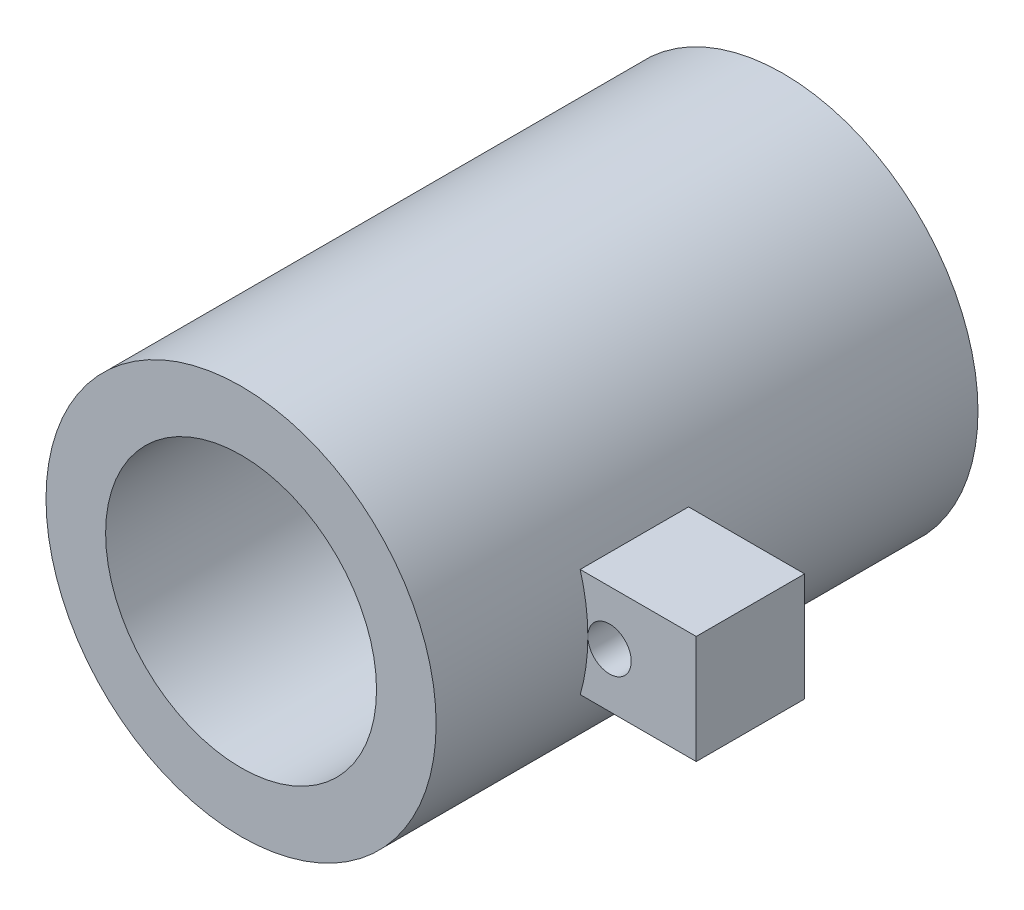
ISO-10303-21;
HEADER;
FILE_DESCRIPTION(('STEP AP214'),'2;1');
FILE_NAME('part.step','',(''),(''),'','','');
FILE_SCHEMA(('AUTOMOTIVE_DESIGN { 1 0 10303 214 1 1 1 1 }'));
ENDSEC;
DATA;
#1=APPLICATION_CONTEXT('core data for automotive mechanical design processes');
#2=APPLICATION_PROTOCOL_DEFINITION('international standard','automotive_design',2000,#1);
#3=PRODUCT_CONTEXT('',#1,'mechanical');
#4=PRODUCT('Part','Part','',(#3));
#5=PRODUCT_RELATED_PRODUCT_CATEGORY('part','',(#4));
#6=PRODUCT_DEFINITION_FORMATION('','',#4);
#7=PRODUCT_DEFINITION_CONTEXT('part definition',#1,'design');
#8=PRODUCT_DEFINITION('design','',#6,#7);
#9=PRODUCT_DEFINITION_SHAPE('','',#8);
#10=(LENGTH_UNIT() NAMED_UNIT(*) SI_UNIT(.MILLI.,.METRE.));
#11=(NAMED_UNIT(*) PLANE_ANGLE_UNIT() SI_UNIT($,.RADIAN.));
#12=(NAMED_UNIT(*) SI_UNIT($,.STERADIAN.) SOLID_ANGLE_UNIT());
#13=UNCERTAINTY_MEASURE_WITH_UNIT(LENGTH_MEASURE(1.E-05),#10,'distance_accuracy_value','');
#14=(GEOMETRIC_REPRESENTATION_CONTEXT(3) GLOBAL_UNCERTAINTY_ASSIGNED_CONTEXT((#13)) GLOBAL_UNIT_ASSIGNED_CONTEXT((#10,
#11,#12)) REPRESENTATION_CONTEXT('',''));
#15=CARTESIAN_POINT('',(0.,0.,0.));
#16=DIRECTION('',(0.,0.,1.));
#17=DIRECTION('',(1.,0.,0.));
#18=AXIS2_PLACEMENT_3D('',#15,#16,#17);
#19=CARTESIAN_POINT('',(0.,0.,12.5));
#20=DIRECTION('',(0.,0.,-1.));
#21=DIRECTION('',(-1.,0.,0.));
#22=AXIS2_PLACEMENT_3D('',#19,#20,#21);
#23=CYLINDRICAL_SURFACE('',#22,9.);
#24=CARTESIAN_POINT('',(0.,0.,0.499999999999999));
#25=DIRECTION('',(0.,0.,1.));
#26=DIRECTION('',(0.,-1.,0.));
#27=AXIS2_PLACEMENT_3D('',#24,#25,#26);
#28=CIRCLE('',#27,9.);
#29=CARTESIAN_POINT('',(9.,0.,0.499999999999999));
#30=VERTEX_POINT('',#29);
#31=CARTESIAN_POINT('',(8.64580823289529,2.5,0.5));
#32=VERTEX_POINT('',#31);
#33=EDGE_CURVE('E40',#30,#32,#28,.T.);
#34=ORIENTED_EDGE('',*,*,#33,.F.);
#35=CARTESIAN_POINT('',(8.64580823289529,-2.5,0.499999999999997));
#36=VERTEX_POINT('',#35);
#37=EDGE_CURVE('E11',#36,#30,#28,.T.);
#38=ORIENTED_EDGE('',*,*,#37,.F.);
#39=DIRECTION('',(0.,0.,-1.));
#40=VECTOR('',#39,1.);
#41=CARTESIAN_POINT('',(8.64580823289529,-2.5,12.5));
#42=LINE('',#41,#40);
#43=CARTESIAN_POINT('',(8.64580823289529,-2.5,5.5));
#44=VERTEX_POINT('',#43);
#45=EDGE_CURVE('E116',#44,#36,#42,.T.);
#46=ORIENTED_EDGE('',*,*,#45,.F.);
#47=CARTESIAN_POINT('',(0.,0.,5.5));
#48=DIRECTION('',(0.,0.,-1.));
#49=DIRECTION('',(0.,1.,0.));
#50=AXIS2_PLACEMENT_3D('',#47,#48,#49);
#51=CIRCLE('',#50,9.);
#52=CARTESIAN_POINT('',(9.,0.,5.5));
#53=VERTEX_POINT('',#52);
#54=EDGE_CURVE('E121',#53,#44,#51,.T.);
#55=ORIENTED_EDGE('',*,*,#54,.F.);
#56=CARTESIAN_POINT('',(8.64580823289529,2.5,5.5));
#57=VERTEX_POINT('',#56);
#58=EDGE_CURVE('E122',#57,#53,#51,.T.);
#59=ORIENTED_EDGE('',*,*,#58,.F.);
#60=DIRECTION('',(0.,0.,-1.));
#61=VECTOR('',#60,1.);
#62=CARTESIAN_POINT('',(8.64580823289529,2.5,12.5));
#63=LINE('',#62,#61);
#64=EDGE_CURVE('E124',#32,#57,#63,.F.);
#65=ORIENTED_EDGE('',*,*,#64,.F.);
#66=EDGE_LOOP('',(#34,#38,#46,#55,#59,#65));
#67=FACE_BOUND('',#66,.T.);
#68=CARTESIAN_POINT('',(0.,0.,-12.5));
#69=DIRECTION('',(0.,0.,1.));
#70=DIRECTION('',(1.,0.,0.));
#71=AXIS2_PLACEMENT_3D('',#68,#69,#70);
#72=CIRCLE('',#71,9.);
#73=CARTESIAN_POINT('',(9.,0.,-12.5));
#74=VERTEX_POINT('',#73);
#75=EDGE_CURVE('E111',#74,#74,#72,.T.);
#76=ORIENTED_EDGE('',*,*,#75,.T.);
#77=EDGE_LOOP('',(#76));
#78=FACE_BOUND('',#77,.T.);
#79=CARTESIAN_POINT('',(0.,0.,12.5));
#80=DIRECTION('',(0.,0.,1.));
#81=DIRECTION('',(1.,0.,0.));
#82=AXIS2_PLACEMENT_3D('',#79,#80,#81);
#83=CIRCLE('',#82,9.);
#84=CARTESIAN_POINT('',(9.,0.,12.5));
#85=VERTEX_POINT('',#84);
#86=EDGE_CURVE('E113',#85,#85,#83,.T.);
#87=ORIENTED_EDGE('',*,*,#86,.F.);
#88=EDGE_LOOP('',(#87));
#89=FACE_BOUND('',#88,.T.);
#90=ADVANCED_FACE('F33',(#67,#78,#89),#23,.T.);
#91=CARTESIAN_POINT('',(0.,0.,12.5));
#92=DIRECTION('',(0.,0.,1.));
#93=DIRECTION('',(1.,0.,0.));
#94=AXIS2_PLACEMENT_3D('',#91,#92,#93);
#95=PLANE('',#94);
#96=ORIENTED_EDGE('',*,*,#86,.T.);
#97=EDGE_LOOP('',(#96));
#98=FACE_BOUND('',#97,.T.);
#99=CARTESIAN_POINT('',(0.,0.,12.5));
#100=DIRECTION('',(0.,0.,1.));
#101=DIRECTION('',(1.,0.,0.));
#102=AXIS2_PLACEMENT_3D('',#99,#100,#101);
#103=CIRCLE('',#102,6.25);
#104=CARTESIAN_POINT('',(6.25,0.,12.5));
#105=VERTEX_POINT('',#104);
#106=EDGE_CURVE('E104',#105,#105,#103,.T.);
#107=ORIENTED_EDGE('',*,*,#106,.F.);
#108=EDGE_LOOP('',(#107));
#109=FACE_BOUND('',#108,.T.);
#110=ADVANCED_FACE('F142',(#98,#109),#95,.T.);
#111=CARTESIAN_POINT('',(0.,0.,-12.5));
#112=DIRECTION('',(0.,0.,1.));
#113=DIRECTION('',(1.,0.,0.));
#114=AXIS2_PLACEMENT_3D('',#111,#112,#113);
#115=PLANE('',#114);
#116=ORIENTED_EDGE('',*,*,#75,.F.);
#117=EDGE_LOOP('',(#116));
#118=FACE_BOUND('',#117,.T.);
#119=CARTESIAN_POINT('',(0.,0.,-12.5));
#120=DIRECTION('',(0.,0.,1.));
#121=DIRECTION('',(1.,0.,0.));
#122=AXIS2_PLACEMENT_3D('',#119,#120,#121);
#123=CIRCLE('',#122,6.25);
#124=CARTESIAN_POINT('',(6.25,0.,-12.5));
#125=VERTEX_POINT('',#124);
#126=EDGE_CURVE('E101',#125,#125,#123,.T.);
#127=ORIENTED_EDGE('',*,*,#126,.T.);
#128=EDGE_LOOP('',(#127));
#129=FACE_BOUND('',#128,.T.);
#130=ADVANCED_FACE('F149',(#118,#129),#115,.F.);
#131=CARTESIAN_POINT('',(0.,0.,12.5));
#132=DIRECTION('',(0.,0.,-1.));
#133=DIRECTION('',(-1.,0.,0.));
#134=AXIS2_PLACEMENT_3D('',#131,#132,#133);
#135=CYLINDRICAL_SURFACE('',#134,6.25);
#136=ORIENTED_EDGE('',*,*,#106,.T.);
#137=EDGE_LOOP('',(#136));
#138=FACE_BOUND('',#137,.T.);
#139=ORIENTED_EDGE('',*,*,#126,.F.);
#140=EDGE_LOOP('',(#139));
#141=FACE_BOUND('',#140,.T.);
#142=ADVANCED_FACE('F153',(#138,#141),#135,.F.);
#143=CARTESIAN_POINT('',(14.,2.5,5.5));
#144=DIRECTION('',(0.,-1.,0.));
#145=DIRECTION('',(0.,0.,-1.));
#146=AXIS2_PLACEMENT_3D('',#143,#144,#145);
#147=PLANE('',#146);
#148=DIRECTION('',(-1.,0.,0.));
#149=VECTOR('',#148,1.);
#150=CARTESIAN_POINT('',(14.,2.5,0.5));
#151=LINE('',#150,#149);
#152=CARTESIAN_POINT('',(14.,2.5,0.5));
#153=VERTEX_POINT('',#152);
#154=EDGE_CURVE('E82',#153,#32,#151,.T.);
#155=ORIENTED_EDGE('',*,*,#154,.T.);
#156=ORIENTED_EDGE('',*,*,#64,.T.);
#157=DIRECTION('',(-1.,0.,0.));
#158=VECTOR('',#157,1.);
#159=CARTESIAN_POINT('',(14.,2.5,5.5));
#160=LINE('',#159,#158);
#161=CARTESIAN_POINT('',(14.,2.5,5.5));
#162=VERTEX_POINT('',#161);
#163=EDGE_CURVE('E84',#162,#57,#160,.T.);
#164=ORIENTED_EDGE('',*,*,#163,.F.);
#165=DIRECTION('',(0.,0.,1.));
#166=VECTOR('',#165,1.);
#167=CARTESIAN_POINT('',(14.,2.5,5.5));
#168=LINE('',#167,#166);
#169=EDGE_CURVE('E77',#153,#162,#168,.T.);
#170=ORIENTED_EDGE('',*,*,#169,.F.);
#171=EDGE_LOOP('',(#155,#156,#164,#170));
#172=FACE_BOUND('',#171,.T.);
#173=ADVANCED_FACE('F79',(#172),#147,.F.);
#174=CARTESIAN_POINT('',(14.,-2.5,5.5));
#175=DIRECTION('',(0.,1.,0.));
#176=DIRECTION('',(0.,0.,1.));
#177=AXIS2_PLACEMENT_3D('',#174,#175,#176);
#178=PLANE('',#177);
#179=DIRECTION('',(-1.,0.,0.));
#180=VECTOR('',#179,1.);
#181=CARTESIAN_POINT('',(14.,-2.5,5.5));
#182=LINE('',#181,#180);
#183=CARTESIAN_POINT('',(14.,-2.5,5.5));
#184=VERTEX_POINT('',#183);
#185=EDGE_CURVE('E106',#184,#44,#182,.T.);
#186=ORIENTED_EDGE('',*,*,#185,.T.);
#187=ORIENTED_EDGE('',*,*,#45,.T.);
#188=DIRECTION('',(-1.,0.,0.));
#189=VECTOR('',#188,1.);
#190=CARTESIAN_POINT('',(14.,-2.5,0.499999999999997));
#191=LINE('',#190,#189);
#192=CARTESIAN_POINT('',(14.,-2.5,0.499999999999997));
#193=VERTEX_POINT('',#192);
#194=EDGE_CURVE('E131',#193,#36,#191,.T.);
#195=ORIENTED_EDGE('',*,*,#194,.F.);
#196=DIRECTION('',(0.,0.,-1.));
#197=VECTOR('',#196,1.);
#198=CARTESIAN_POINT('',(14.,-2.5,5.5));
#199=LINE('',#198,#197);
#200=EDGE_CURVE('E93',#184,#193,#199,.T.);
#201=ORIENTED_EDGE('',*,*,#200,.F.);
#202=EDGE_LOOP('',(#186,#187,#195,#201));
#203=FACE_BOUND('',#202,.T.);
#204=ADVANCED_FACE('F135',(#203),#178,.F.);
#205=CARTESIAN_POINT('',(14.,2.5,0.5));
#206=DIRECTION('',(0.,0.,1.));
#207=DIRECTION('',(0.,-1.,0.));
#208=AXIS2_PLACEMENT_3D('',#205,#206,#207);
#209=PLANE('',#208);
#210=ORIENTED_EDGE('',*,*,#37,.T.);
#211=CARTESIAN_POINT('',(10.,0.,0.499999999999999));
#212=DIRECTION('',(0.,0.,1.));
#213=DIRECTION('',(0.,-1.,0.));
#214=AXIS2_PLACEMENT_3D('',#211,#212,#213);
#215=CIRCLE('',#214,1.);
#216=EDGE_CURVE('E45',#30,#30,#215,.T.);
#217=ORIENTED_EDGE('',*,*,#216,.T.);
#218=ORIENTED_EDGE('',*,*,#33,.T.);
#219=ORIENTED_EDGE('',*,*,#154,.F.);
#220=DIRECTION('',(0.,1.,0.));
#221=VECTOR('',#220,1.);
#222=CARTESIAN_POINT('',(14.,2.5,0.5));
#223=LINE('',#222,#221);
#224=EDGE_CURVE('E88',#193,#153,#223,.T.);
#225=ORIENTED_EDGE('',*,*,#224,.F.);
#226=ORIENTED_EDGE('',*,*,#194,.T.);
#227=EDGE_LOOP('',(#210,#217,#218,#219,#225,#226));
#228=FACE_BOUND('',#227,.T.);
#229=ADVANCED_FACE('F98',(#228),#209,.F.);
#230=CARTESIAN_POINT('',(14.,2.5,5.5));
#231=DIRECTION('',(0.,0.,-1.));
#232=DIRECTION('',(0.,1.,0.));
#233=AXIS2_PLACEMENT_3D('',#230,#231,#232);
#234=PLANE('',#233);
#235=ORIENTED_EDGE('',*,*,#58,.T.);
#236=CARTESIAN_POINT('',(10.,0.,5.5));
#237=DIRECTION('',(0.,0.,1.));
#238=DIRECTION('',(1.,0.,0.));
#239=AXIS2_PLACEMENT_3D('',#236,#237,#238);
#240=CIRCLE('',#239,1.);
#241=EDGE_CURVE('E50',#53,#53,#240,.T.);
#242=ORIENTED_EDGE('',*,*,#241,.F.);
#243=ORIENTED_EDGE('',*,*,#54,.T.);
#244=ORIENTED_EDGE('',*,*,#185,.F.);
#245=DIRECTION('',(0.,-1.,0.));
#246=VECTOR('',#245,1.);
#247=CARTESIAN_POINT('',(14.,2.5,5.5));
#248=LINE('',#247,#246);
#249=EDGE_CURVE('E87',#162,#184,#248,.T.);
#250=ORIENTED_EDGE('',*,*,#249,.F.);
#251=ORIENTED_EDGE('',*,*,#163,.T.);
#252=EDGE_LOOP('',(#235,#242,#243,#244,#250,#251));
#253=FACE_BOUND('',#252,.T.);
#254=ADVANCED_FACE('F127',(#253),#234,.F.);
#255=CARTESIAN_POINT('',(14.,0.,0.));
#256=DIRECTION('',(1.,0.,0.));
#257=DIRECTION('',(0.,0.,-1.));
#258=AXIS2_PLACEMENT_3D('',#255,#256,#257);
#259=PLANE('',#258);
#260=ORIENTED_EDGE('',*,*,#224,.T.);
#261=ORIENTED_EDGE('',*,*,#169,.T.);
#262=ORIENTED_EDGE('',*,*,#249,.T.);
#263=ORIENTED_EDGE('',*,*,#200,.T.);
#264=EDGE_LOOP('',(#260,#261,#262,#263));
#265=FACE_BOUND('',#264,.T.);
#266=ADVANCED_FACE('F91',(#265),#259,.T.);
#267=CARTESIAN_POINT('',(10.,0.,-2.5));
#268=DIRECTION('',(0.,0.,1.));
#269=DIRECTION('',(1.,0.,0.));
#270=AXIS2_PLACEMENT_3D('',#267,#268,#269);
#271=CYLINDRICAL_SURFACE('',#270,1.);
#272=ORIENTED_EDGE('',*,*,#241,.T.);
#273=EDGE_LOOP('',(#272));
#274=FACE_BOUND('',#273,.T.);
#275=ORIENTED_EDGE('',*,*,#216,.F.);
#276=EDGE_LOOP('',(#275));
#277=FACE_BOUND('',#276,.T.);
#278=ADVANCED_FACE('F174',(#274,#277),#271,.F.);
#279=CLOSED_SHELL('',(#90,#110,#130,#142,#173,#204,#229,#254,#266,#278));
#280=MANIFOLD_SOLID_BREP('B2',#279);
#281=ADVANCED_BREP_SHAPE_REPRESENTATION('',(#18,#280),#14);
#282=SHAPE_DEFINITION_REPRESENTATION(#9,#281);
ENDSEC;
END-ISO-10303-21;
